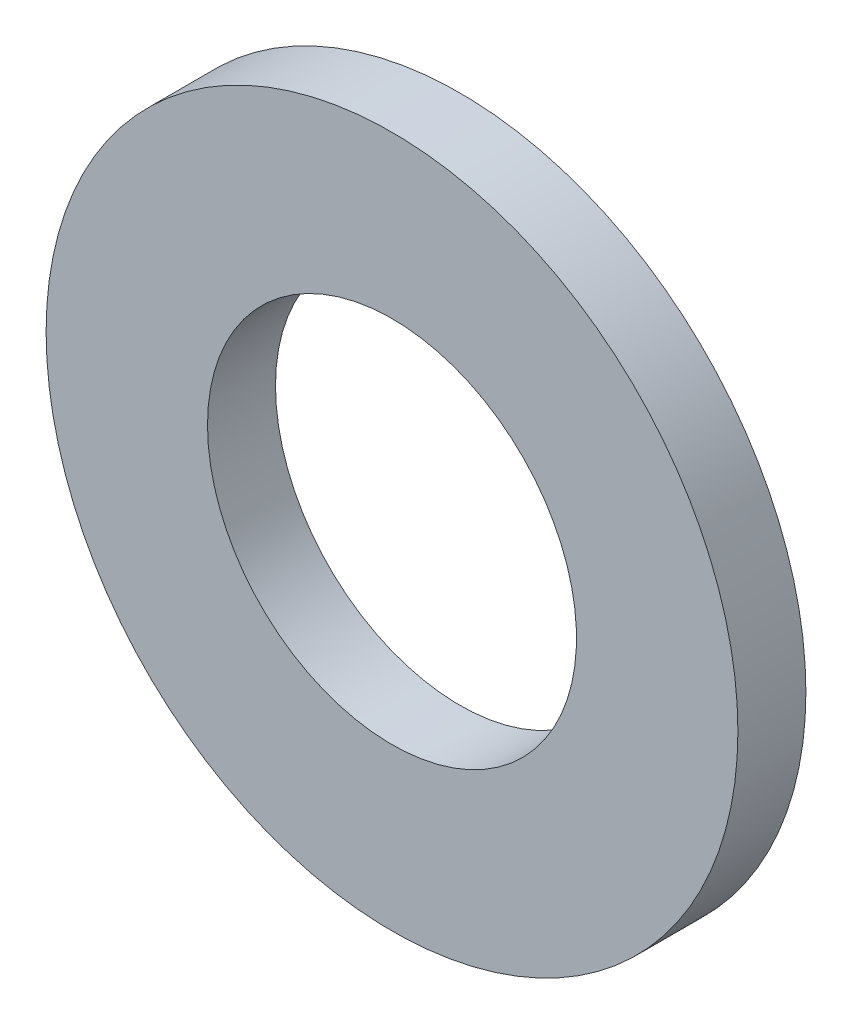
ISO-10303-21;
HEADER;
FILE_DESCRIPTION(('STEP AP214'),'2;1');
FILE_NAME('part.step','',(''),(''),'','','');
FILE_SCHEMA(('AUTOMOTIVE_DESIGN { 1 0 10303 214 1 1 1 1 }'));
ENDSEC;
DATA;
#1=APPLICATION_CONTEXT('core data for automotive mechanical design processes');
#2=APPLICATION_PROTOCOL_DEFINITION('international standard','automotive_design',2000,#1);
#3=PRODUCT_CONTEXT('',#1,'mechanical');
#4=PRODUCT('Part','Part','',(#3));
#5=PRODUCT_RELATED_PRODUCT_CATEGORY('part','',(#4));
#6=PRODUCT_DEFINITION_FORMATION('','',#4);
#7=PRODUCT_DEFINITION_CONTEXT('part definition',#1,'design');
#8=PRODUCT_DEFINITION('design','',#6,#7);
#9=PRODUCT_DEFINITION_SHAPE('','',#8);
#10=(LENGTH_UNIT() NAMED_UNIT(*) SI_UNIT(.MILLI.,.METRE.));
#11=(NAMED_UNIT(*) PLANE_ANGLE_UNIT() SI_UNIT($,.RADIAN.));
#12=(NAMED_UNIT(*) SI_UNIT($,.STERADIAN.) SOLID_ANGLE_UNIT());
#13=UNCERTAINTY_MEASURE_WITH_UNIT(LENGTH_MEASURE(1.E-05),#10,'distance_accuracy_value','');
#14=(GEOMETRIC_REPRESENTATION_CONTEXT(3) GLOBAL_UNCERTAINTY_ASSIGNED_CONTEXT((#13)) GLOBAL_UNIT_ASSIGNED_CONTEXT((#10,
#11,#12)) REPRESENTATION_CONTEXT('',''));
#15=CARTESIAN_POINT('',(0.,0.,0.));
#16=DIRECTION('',(0.,0.,1.));
#17=DIRECTION('',(1.,0.,0.));
#18=AXIS2_PLACEMENT_3D('',#15,#16,#17);
#19=CARTESIAN_POINT('',(0.,0.,2.34));
#20=DIRECTION('',(0.,0.,1.));
#21=DIRECTION('',(1.,0.,0.));
#22=AXIS2_PLACEMENT_3D('',#19,#20,#21);
#23=PLANE('',#22);
#24=CARTESIAN_POINT('',(0.,0.,2.34));
#25=DIRECTION('',(0.,0.,1.));
#26=DIRECTION('',(1.,0.,0.));
#27=AXIS2_PLACEMENT_3D('',#24,#25,#26);
#28=CIRCLE('',#27,11.905);
#29=CARTESIAN_POINT('',(-11.905,0.,2.34));
#30=VERTEX_POINT('',#29);
#31=EDGE_CURVE('E10',#30,#30,#28,.T.);
#32=ORIENTED_EDGE('',*,*,#31,.T.);
#33=EDGE_LOOP('',(#32));
#34=FACE_BOUND('',#33,.T.);
#35=CARTESIAN_POINT('',(0.,0.,2.34));
#36=DIRECTION('',(0.,0.,1.));
#37=DIRECTION('',(1.,0.,0.));
#38=AXIS2_PLACEMENT_3D('',#35,#36,#37);
#39=CIRCLE('',#38,6.35);
#40=CARTESIAN_POINT('',(-6.35,0.,2.34));
#41=VERTEX_POINT('',#40);
#42=EDGE_CURVE('E42',#41,#41,#39,.T.);
#43=ORIENTED_EDGE('',*,*,#42,.F.);
#44=EDGE_LOOP('',(#43));
#45=FACE_BOUND('',#44,.T.);
#46=ADVANCED_FACE('F31',(#34,#45),#23,.T.);
#47=CARTESIAN_POINT('',(0.,0.,0.));
#48=DIRECTION('',(0.,0.,1.));
#49=DIRECTION('',(1.,0.,0.));
#50=AXIS2_PLACEMENT_3D('',#47,#48,#49);
#51=PLANE('',#50);
#52=CARTESIAN_POINT('',(0.,0.,0.));
#53=DIRECTION('',(0.,0.,1.));
#54=DIRECTION('',(1.,0.,0.));
#55=AXIS2_PLACEMENT_3D('',#52,#53,#54);
#56=CIRCLE('',#55,11.905);
#57=CARTESIAN_POINT('',(-11.905,0.,0.));
#58=VERTEX_POINT('',#57);
#59=EDGE_CURVE('E35',#58,#58,#56,.T.);
#60=ORIENTED_EDGE('',*,*,#59,.F.);
#61=EDGE_LOOP('',(#60));
#62=FACE_BOUND('',#61,.T.);
#63=CARTESIAN_POINT('',(0.,0.,0.));
#64=DIRECTION('',(0.,0.,1.));
#65=DIRECTION('',(1.,0.,0.));
#66=AXIS2_PLACEMENT_3D('',#63,#64,#65);
#67=CIRCLE('',#66,6.35);
#68=CARTESIAN_POINT('',(-6.35,0.,0.));
#69=VERTEX_POINT('',#68);
#70=EDGE_CURVE('E44',#69,#69,#67,.T.);
#71=ORIENTED_EDGE('',*,*,#70,.T.);
#72=EDGE_LOOP('',(#71));
#73=FACE_BOUND('',#72,.T.);
#74=ADVANCED_FACE('F54',(#62,#73),#51,.F.);
#75=CARTESIAN_POINT('',(0.,0.,2.34));
#76=DIRECTION('',(0.,0.,-1.));
#77=DIRECTION('',(-1.,0.,0.));
#78=AXIS2_PLACEMENT_3D('',#75,#76,#77);
#79=CYLINDRICAL_SURFACE('',#78,11.905);
#80=CARTESIAN_POINT('',(-11.905,0.,2.34));
#81=CARTESIAN_POINT('',(-11.905,0.,2.315625));
#82=CARTESIAN_POINT('',(-11.905,0.,2.29125));
#83=CARTESIAN_POINT('',(-11.905,0.,2.2425));
#84=CARTESIAN_POINT('',(-11.905,0.,2.218125));
#85=CARTESIAN_POINT('',(-11.905,0.,2.169375));
#86=CARTESIAN_POINT('',(-11.905,0.,2.145));
#87=CARTESIAN_POINT('',(-11.905,0.,2.09625));
#88=CARTESIAN_POINT('',(-11.905,0.,2.071875));
#89=CARTESIAN_POINT('',(-11.905,0.,2.023125));
#90=CARTESIAN_POINT('',(-11.905,0.,1.99875));
#91=CARTESIAN_POINT('',(-11.905,0.,1.95));
#92=CARTESIAN_POINT('',(-11.905,0.,1.925625));
#93=CARTESIAN_POINT('',(-11.905,0.,1.876875));
#94=CARTESIAN_POINT('',(-11.905,0.,1.8525));
#95=CARTESIAN_POINT('',(-11.905,0.,1.80375));
#96=CARTESIAN_POINT('',(-11.905,0.,1.779375));
#97=CARTESIAN_POINT('',(-11.905,0.,1.730625));
#98=CARTESIAN_POINT('',(-11.905,0.,1.70625));
#99=CARTESIAN_POINT('',(-11.905,0.,1.6575));
#100=CARTESIAN_POINT('',(-11.905,0.,1.633125));
#101=CARTESIAN_POINT('',(-11.905,0.,1.584375));
#102=CARTESIAN_POINT('',(-11.905,0.,1.56));
#103=CARTESIAN_POINT('',(-11.905,0.,1.51125));
#104=CARTESIAN_POINT('',(-11.905,0.,1.486875));
#105=CARTESIAN_POINT('',(-11.905,0.,1.438125));
#106=CARTESIAN_POINT('',(-11.905,0.,1.41375));
#107=CARTESIAN_POINT('',(-11.905,0.,1.365));
#108=CARTESIAN_POINT('',(-11.905,0.,1.340625));
#109=CARTESIAN_POINT('',(-11.905,0.,1.291875));
#110=CARTESIAN_POINT('',(-11.905,0.,1.2675));
#111=CARTESIAN_POINT('',(-11.905,0.,1.21875));
#112=CARTESIAN_POINT('',(-11.905,0.,1.194375));
#113=CARTESIAN_POINT('',(-11.905,0.,1.145625));
#114=CARTESIAN_POINT('',(-11.905,0.,1.12125));
#115=CARTESIAN_POINT('',(-11.905,0.,1.0725));
#116=CARTESIAN_POINT('',(-11.905,0.,1.048125));
#117=CARTESIAN_POINT('',(-11.905,0.,0.999374999999999));
#118=CARTESIAN_POINT('',(-11.905,0.,0.974999999999999));
#119=CARTESIAN_POINT('',(-11.905,0.,0.926249999999999));
#120=CARTESIAN_POINT('',(-11.905,0.,0.901874999999999));
#121=CARTESIAN_POINT('',(-11.905,0.,0.853124999999999));
#122=CARTESIAN_POINT('',(-11.905,0.,0.82875));
#123=CARTESIAN_POINT('',(-11.905,0.,0.78));
#124=CARTESIAN_POINT('',(-11.905,0.,0.755624999999999));
#125=CARTESIAN_POINT('',(-11.905,0.,0.706874999999999));
#126=CARTESIAN_POINT('',(-11.905,0.,0.682499999999999));
#127=CARTESIAN_POINT('',(-11.905,0.,0.633749999999999));
#128=CARTESIAN_POINT('',(-11.905,0.,0.609374999999999));
#129=CARTESIAN_POINT('',(-11.905,0.,0.560624999999999));
#130=CARTESIAN_POINT('',(-11.905,0.,0.536249999999999));
#131=CARTESIAN_POINT('',(-11.905,0.,0.487499999999999));
#132=CARTESIAN_POINT('',(-11.905,0.,0.463124999999999));
#133=CARTESIAN_POINT('',(-11.905,0.,0.414374999999999));
#134=CARTESIAN_POINT('',(-11.905,0.,0.39));
#135=CARTESIAN_POINT('',(-11.905,0.,0.34125));
#136=CARTESIAN_POINT('',(-11.905,0.,0.316875));
#137=CARTESIAN_POINT('',(-11.905,0.,0.268125));
#138=CARTESIAN_POINT('',(-11.905,0.,0.24375));
#139=CARTESIAN_POINT('',(-11.905,0.,0.195));
#140=CARTESIAN_POINT('',(-11.905,0.,0.170625));
#141=CARTESIAN_POINT('',(-11.905,0.,0.121875));
#142=CARTESIAN_POINT('',(-11.905,0.,0.0974999999999995));
#143=CARTESIAN_POINT('',(-11.905,0.,0.0487499999999995));
#144=CARTESIAN_POINT('',(-11.905,0.,0.0243749999999995));
#145=CARTESIAN_POINT('',(-11.905,0.,0.));
#146=B_SPLINE_CURVE_WITH_KNOTS('',3,(#80,#81,#82,#83,#84,#85,#86,#87,#88,#89,#90,#91,#92,#93,
#94,#95,#96,#97,#98,#99,#100,#101,#102,#103,#104,#105,#106,#107,#108,#109,#110,#111,#112,#113,
#114,#115,#116,#117,#118,#119,#120,#121,#122,#123,#124,#125,#126,#127,#128,#129,#130,#131,#132,
#133,#134,#135,#136,#137,#138,#139,#140,#141,#142,#143,#144,#145),.UNSPECIFIED.,.F.,.F.,(4,2,2,
2,2,2,2,2,2,2,2,2,2,2,2,2,2,2,2,2,2,2,2,2,2,2,2,2,2,2,2,2,4),(0.,0.0731250000000003,0.14625,
0.219375,0.2925,0.365625,0.43875,0.511875,0.585,0.658125,0.731250000000001,0.804375,
0.877500000000001,0.950625,1.02375,1.096875,1.17,1.243125,1.31625,1.389375,1.4625,1.535625,
1.60875,1.681875,1.755,1.828125,1.90125,1.974375,2.0475,2.120625,2.19375,2.266875,2.34),.UNSPECIFIED.);
#147=EDGE_CURVE('BSEAM33',#30,#58,#146,.T.);
#148=ORIENTED_EDGE('',*,*,#31,.F.);
#149=ORIENTED_EDGE('',*,*,#59,.T.);
#150=ORIENTED_EDGE('',*,*,#147,.T.);
#151=ORIENTED_EDGE('',*,*,#147,.F.);
#152=EDGE_LOOP('',(#148,#150,#149,#151));
#153=FACE_BOUND('',#152,.T.);
#154=ADVANCED_FACE('F33',(#153),#79,.T.);
#155=CARTESIAN_POINT('',(0.,0.,2.34));
#156=DIRECTION('',(0.,0.,-1.));
#157=DIRECTION('',(-1.,0.,0.));
#158=AXIS2_PLACEMENT_3D('',#155,#156,#157);
#159=CYLINDRICAL_SURFACE('',#158,6.35);
#160=CARTESIAN_POINT('',(-6.35,0.,2.34));
#161=CARTESIAN_POINT('',(-6.35,0.,2.315625));
#162=CARTESIAN_POINT('',(-6.35,0.,2.29125));
#163=CARTESIAN_POINT('',(-6.35,0.,2.2425));
#164=CARTESIAN_POINT('',(-6.35,0.,2.218125));
#165=CARTESIAN_POINT('',(-6.35,0.,2.169375));
#166=CARTESIAN_POINT('',(-6.35,0.,2.145));
#167=CARTESIAN_POINT('',(-6.35,0.,2.09625));
#168=CARTESIAN_POINT('',(-6.35,0.,2.071875));
#169=CARTESIAN_POINT('',(-6.35,0.,2.023125));
#170=CARTESIAN_POINT('',(-6.35,0.,1.99875));
#171=CARTESIAN_POINT('',(-6.35,0.,1.95));
#172=CARTESIAN_POINT('',(-6.35,0.,1.925625));
#173=CARTESIAN_POINT('',(-6.35,0.,1.876875));
#174=CARTESIAN_POINT('',(-6.35,0.,1.8525));
#175=CARTESIAN_POINT('',(-6.35,0.,1.80375));
#176=CARTESIAN_POINT('',(-6.35,0.,1.779375));
#177=CARTESIAN_POINT('',(-6.35,0.,1.730625));
#178=CARTESIAN_POINT('',(-6.35,0.,1.70625));
#179=CARTESIAN_POINT('',(-6.35,0.,1.6575));
#180=CARTESIAN_POINT('',(-6.35,0.,1.633125));
#181=CARTESIAN_POINT('',(-6.35,0.,1.584375));
#182=CARTESIAN_POINT('',(-6.35,0.,1.56));
#183=CARTESIAN_POINT('',(-6.35,0.,1.51125));
#184=CARTESIAN_POINT('',(-6.35,0.,1.486875));
#185=CARTESIAN_POINT('',(-6.35,0.,1.438125));
#186=CARTESIAN_POINT('',(-6.35,0.,1.41375));
#187=CARTESIAN_POINT('',(-6.35,0.,1.365));
#188=CARTESIAN_POINT('',(-6.35,0.,1.340625));
#189=CARTESIAN_POINT('',(-6.35,0.,1.291875));
#190=CARTESIAN_POINT('',(-6.35,0.,1.2675));
#191=CARTESIAN_POINT('',(-6.35,0.,1.21875));
#192=CARTESIAN_POINT('',(-6.35,0.,1.194375));
#193=CARTESIAN_POINT('',(-6.35,0.,1.145625));
#194=CARTESIAN_POINT('',(-6.35,0.,1.12125));
#195=CARTESIAN_POINT('',(-6.35,0.,1.0725));
#196=CARTESIAN_POINT('',(-6.35,0.,1.048125));
#197=CARTESIAN_POINT('',(-6.35,0.,0.999375));
#198=CARTESIAN_POINT('',(-6.35,0.,0.975));
#199=CARTESIAN_POINT('',(-6.35,0.,0.92625));
#200=CARTESIAN_POINT('',(-6.35,0.,0.901875));
#201=CARTESIAN_POINT('',(-6.35,0.,0.853125));
#202=CARTESIAN_POINT('',(-6.35,0.,0.82875));
#203=CARTESIAN_POINT('',(-6.35,0.,0.78));
#204=CARTESIAN_POINT('',(-6.35,0.,0.755625));
#205=CARTESIAN_POINT('',(-6.35,0.,0.706875));
#206=CARTESIAN_POINT('',(-6.35,0.,0.6825));
#207=CARTESIAN_POINT('',(-6.35,0.,0.63375));
#208=CARTESIAN_POINT('',(-6.35,0.,0.609375));
#209=CARTESIAN_POINT('',(-6.35,0.,0.560625));
#210=CARTESIAN_POINT('',(-6.35,0.,0.53625));
#211=CARTESIAN_POINT('',(-6.35,0.,0.4875));
#212=CARTESIAN_POINT('',(-6.35,0.,0.463125));
#213=CARTESIAN_POINT('',(-6.35,0.,0.414375));
#214=CARTESIAN_POINT('',(-6.35,0.,0.39));
#215=CARTESIAN_POINT('',(-6.35,0.,0.34125));
#216=CARTESIAN_POINT('',(-6.35,0.,0.316875));
#217=CARTESIAN_POINT('',(-6.35,0.,0.268125));
#218=CARTESIAN_POINT('',(-6.35,0.,0.24375));
#219=CARTESIAN_POINT('',(-6.35,0.,0.195));
#220=CARTESIAN_POINT('',(-6.35,0.,0.170625));
#221=CARTESIAN_POINT('',(-6.35,0.,0.121875));
#222=CARTESIAN_POINT('',(-6.35,0.,0.0974999999999995));
#223=CARTESIAN_POINT('',(-6.35,0.,0.0487499999999995));
#224=CARTESIAN_POINT('',(-6.35,0.,0.0243749999999995));
#225=CARTESIAN_POINT('',(-6.35,0.,0.));
#226=B_SPLINE_CURVE_WITH_KNOTS('',3,(#160,#161,#162,#163,#164,#165,#166,#167,#168,#169,#170,
#171,#172,#173,#174,#175,#176,#177,#178,#179,#180,#181,#182,#183,#184,#185,#186,#187,#188,#189,
#190,#191,#192,#193,#194,#195,#196,#197,#198,#199,#200,#201,#202,#203,#204,#205,#206,#207,#208,
#209,#210,#211,#212,#213,#214,#215,#216,#217,#218,#219,#220,#221,#222,#223,#224,#225),
.UNSPECIFIED.,.F.,.F.,(4,2,2,2,2,2,2,2,2,2,2,2,2,2,2,2,2,2,2,2,2,2,2,2,2,2,2,2,2,2,2,2,4),(0.,
0.0731249999999998,0.14625,0.219375,0.2925,0.365625,0.43875,0.511875,0.585,0.658125,0.73125,
0.804375,0.8775,0.950625,1.02375,1.096875,1.17,1.243125,1.31625,1.389375,1.4625,1.535625,
1.60875,1.681875,1.755,1.828125,1.90125,1.974375,2.0475,2.120625,2.19375,2.266875,2.34),.UNSPECIFIED.);
#227=EDGE_CURVE('BSEAM50',#41,#69,#226,.T.);
#228=ORIENTED_EDGE('',*,*,#42,.T.);
#229=ORIENTED_EDGE('',*,*,#70,.F.);
#230=ORIENTED_EDGE('',*,*,#227,.T.);
#231=ORIENTED_EDGE('',*,*,#227,.F.);
#232=EDGE_LOOP('',(#228,#230,#229,#231));
#233=FACE_BOUND('',#232,.T.);
#234=ADVANCED_FACE('F50',(#233),#159,.F.);
#235=CLOSED_SHELL('',(#46,#74,#154,#234));
#236=MANIFOLD_SOLID_BREP('B2',#235);
#237=ADVANCED_BREP_SHAPE_REPRESENTATION('',(#18,#236),#14);
#238=SHAPE_DEFINITION_REPRESENTATION(#9,#237);
ENDSEC;
END-ISO-10303-21;
